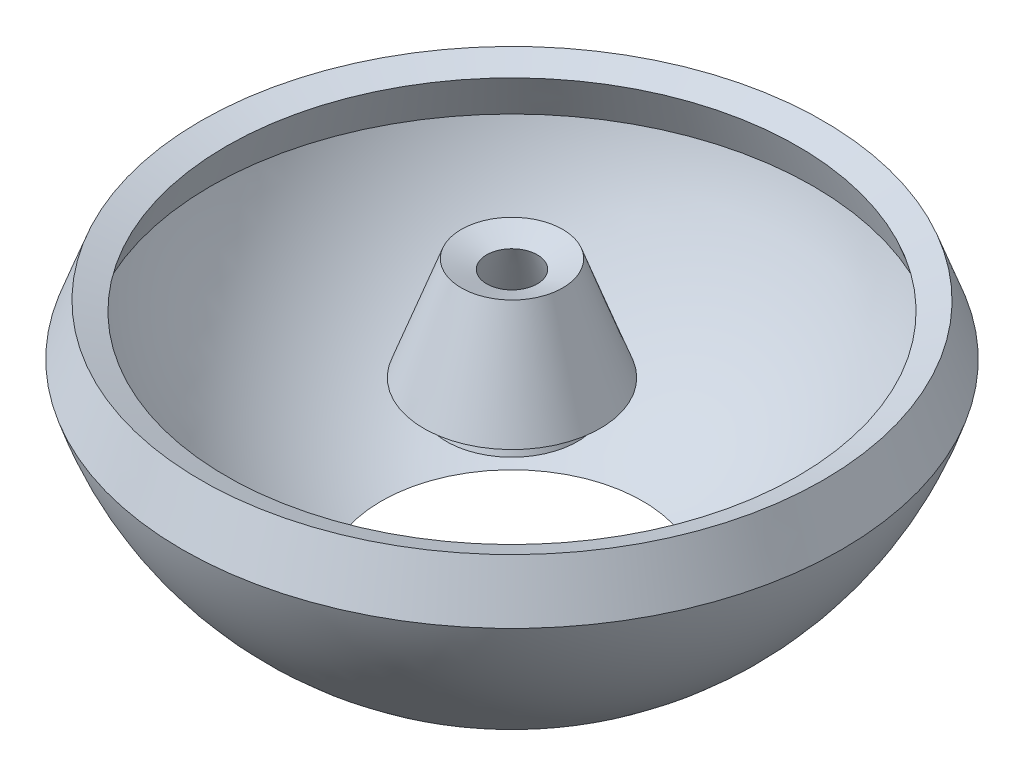
ISO-10303-21;
HEADER;
FILE_DESCRIPTION(('STEP AP214'),'2;1');
FILE_NAME('part.step','',(''),(''),'','','');
FILE_SCHEMA(('AUTOMOTIVE_DESIGN { 1 0 10303 214 1 1 1 1 }'));
ENDSEC;
DATA;
#1=APPLICATION_CONTEXT('core data for automotive mechanical design processes');
#2=APPLICATION_PROTOCOL_DEFINITION('international standard','automotive_design',2000,#1);
#3=PRODUCT_CONTEXT('',#1,'mechanical');
#4=PRODUCT('Part','Part','',(#3));
#5=PRODUCT_RELATED_PRODUCT_CATEGORY('part','',(#4));
#6=PRODUCT_DEFINITION_FORMATION('','',#4);
#7=PRODUCT_DEFINITION_CONTEXT('part definition',#1,'design');
#8=PRODUCT_DEFINITION('design','',#6,#7);
#9=PRODUCT_DEFINITION_SHAPE('','',#8);
#10=(LENGTH_UNIT() NAMED_UNIT(*) SI_UNIT(.MILLI.,.METRE.));
#11=(NAMED_UNIT(*) PLANE_ANGLE_UNIT() SI_UNIT($,.RADIAN.));
#12=(NAMED_UNIT(*) SI_UNIT($,.STERADIAN.) SOLID_ANGLE_UNIT());
#13=UNCERTAINTY_MEASURE_WITH_UNIT(LENGTH_MEASURE(1.E-05),#10,'distance_accuracy_value','');
#14=(GEOMETRIC_REPRESENTATION_CONTEXT(3) GLOBAL_UNCERTAINTY_ASSIGNED_CONTEXT((#13)) GLOBAL_UNIT_ASSIGNED_CONTEXT((#10,
#11,#12)) REPRESENTATION_CONTEXT('',''));
#15=CARTESIAN_POINT('',(0.,0.,0.));
#16=DIRECTION('',(0.,0.,1.));
#17=DIRECTION('',(1.,0.,0.));
#18=AXIS2_PLACEMENT_3D('',#15,#16,#17);
#19=CARTESIAN_POINT('',(0.,-43.4771990234914,0.));
#20=DIRECTION('',(0.,-1.,0.));
#21=DIRECTION('',(1.,0.,0.));
#22=AXIS2_PLACEMENT_3D('',#19,#20,#21);
#23=CONICAL_SURFACE('',#22,32.5852062303105,0.349065850398709);
#24=CARTESIAN_POINT('',(0.,-5.41964788165997,0.));
#25=DIRECTION('',(0.,1.,0.));
#26=DIRECTION('',(-1.,0.,0.));
#27=AXIS2_PLACEMENT_3D('',#24,#25,#26);
#28=CIRCLE('',#27,18.7333904256269);
#29=CARTESIAN_POINT('',(-18.7333904256269,-5.41964788165997,0.));
#30=VERTEX_POINT('',#29);
#31=EDGE_CURVE('E79',#30,#30,#28,.T.);
#32=ORIENTED_EDGE('',*,*,#31,.F.);
#33=EDGE_LOOP('',(#32));
#34=FACE_BOUND('',#33,.T.);
#35=CARTESIAN_POINT('',(0.,-43.4771990234914,0.));
#36=DIRECTION('',(0.,1.,0.));
#37=DIRECTION('',(-1.,0.,0.));
#38=AXIS2_PLACEMENT_3D('',#35,#36,#37);
#39=CIRCLE('',#38,32.5852062303105);
#40=CARTESIAN_POINT('',(-32.5852062303105,-43.4771990234914,0.));
#41=VERTEX_POINT('',#40);
#42=EDGE_CURVE('E11',#41,#41,#39,.T.);
#43=ORIENTED_EDGE('',*,*,#42,.T.);
#44=EDGE_LOOP('',(#43));
#45=FACE_BOUND('',#44,.T.);
#46=ADVANCED_FACE('F51',(#34,#45),#23,.T.);
#47=CARTESIAN_POINT('',(0.,-47.1539155642398,0.));
#48=DIRECTION('',(0.,1.,0.));
#49=DIRECTION('',(-1.,0.,0.));
#50=AXIS2_PLACEMENT_3D('',#47,#48,#49);
#51=CONICAL_SURFACE('',#50,22.4835105568642,1.22173047639619);
#52=ORIENTED_EDGE('',*,*,#42,.F.);
#53=EDGE_LOOP('',(#52));
#54=FACE_BOUND('',#53,.T.);
#55=CARTESIAN_POINT('',(0.,-47.1539155642398,0.));
#56=DIRECTION('',(0.,1.,0.));
#57=DIRECTION('',(-1.,0.,0.));
#58=AXIS2_PLACEMENT_3D('',#55,#56,#57);
#59=CIRCLE('',#58,22.4835105568642);
#60=CARTESIAN_POINT('',(-22.4835105568642,-47.1539155642398,0.));
#61=VERTEX_POINT('',#60);
#62=EDGE_CURVE('E57',#61,#61,#59,.T.);
#63=ORIENTED_EDGE('',*,*,#62,.T.);
#64=EDGE_LOOP('',(#63));
#65=FACE_BOUND('',#64,.T.);
#66=ADVANCED_FACE('F87',(#54,#65),#51,.T.);
#67=CARTESIAN_POINT('',(0.,-51.8523786681699,0.));
#68=DIRECTION('',(0.,-1.,0.));
#69=DIRECTION('',(1.,0.,0.));
#70=AXIS2_PLACEMENT_3D('',#67,#68,#69);
#71=CONICAL_SURFACE('',#70,24.1936112734919,0.349065850398704);
#72=ORIENTED_EDGE('',*,*,#62,.F.);
#73=EDGE_LOOP('',(#72));
#74=FACE_BOUND('',#73,.T.);
#75=CARTESIAN_POINT('',(0.,-51.8523786681699,0.));
#76=DIRECTION('',(0.,1.,0.));
#77=DIRECTION('',(-1.,0.,0.));
#78=AXIS2_PLACEMENT_3D('',#75,#76,#77);
#79=CIRCLE('',#78,24.1936112734919);
#80=CARTESIAN_POINT('',(-24.1936112734919,-51.8523786681699,0.));
#81=VERTEX_POINT('',#80);
#82=EDGE_CURVE('E61',#81,#81,#79,.T.);
#83=ORIENTED_EDGE('',*,*,#82,.T.);
#84=EDGE_LOOP('',(#83));
#85=FACE_BOUND('',#84,.T.);
#86=ADVANCED_FACE('F91',(#74,#85),#71,.T.);
#87=CARTESIAN_POINT('',(0.,-51.8523786681699,0.));
#88=DIRECTION('',(0.,1.,0.));
#89=DIRECTION('',(-1.,0.,0.));
#90=AXIS2_PLACEMENT_3D('',#87,#88,#89);
#91=CONICAL_SURFACE('',#90,24.1936112734919,1.22173047639619);
#92=CARTESIAN_POINT('',(0.,-55.272580101425,0.));
#93=DIRECTION('',(0.,1.,0.));
#94=DIRECTION('',(-1.,0.,0.));
#95=AXIS2_PLACEMENT_3D('',#92,#93,#94);
#96=CIRCLE('',#95,14.7966850656322);
#97=CARTESIAN_POINT('',(-14.7966850656322,-55.272580101425,0.));
#98=VERTEX_POINT('',#97);
#99=EDGE_CURVE('E65',#98,#98,#96,.T.);
#100=ORIENTED_EDGE('',*,*,#99,.T.);
#101=EDGE_LOOP('',(#100));
#102=FACE_BOUND('',#101,.T.);
#103=ORIENTED_EDGE('',*,*,#82,.F.);
#104=EDGE_LOOP('',(#103));
#105=FACE_BOUND('',#104,.T.);
#106=ADVANCED_FACE('F96',(#102,#105),#91,.T.);
#107=CARTESIAN_POINT('',(0.,-55.272580101425,0.));
#108=DIRECTION('',(0.,-1.,0.));
#109=DIRECTION('',(1.,0.,0.));
#110=AXIS2_PLACEMENT_3D('',#107,#108,#109);
#111=CONICAL_SURFACE('',#110,14.7966850656322,0.349065850398705);
#112=CARTESIAN_POINT('',(0.,-41.1771907896353,0.));
#113=DIRECTION('',(0.,1.,0.));
#114=DIRECTION('',(-1.,0.,0.));
#115=AXIS2_PLACEMENT_3D('',#112,#113,#114);
#116=CIRCLE('',#115,9.6663829157494);
#117=CARTESIAN_POINT('',(-9.66638291574939,-41.1771907896353,0.));
#118=VERTEX_POINT('',#117);
#119=EDGE_CURVE('E70',#118,#118,#116,.T.);
#120=ORIENTED_EDGE('',*,*,#119,.T.);
#121=EDGE_LOOP('',(#120));
#122=FACE_BOUND('',#121,.T.);
#123=ORIENTED_EDGE('',*,*,#99,.F.);
#124=EDGE_LOOP('',(#123));
#125=FACE_BOUND('',#124,.T.);
#126=ADVANCED_FACE('F102',(#122,#125),#111,.F.);
#127=CARTESIAN_POINT('',(0.,-41.1771907896353,0.));
#128=DIRECTION('',(0.,1.,0.));
#129=DIRECTION('',(-1.,0.,0.));
#130=AXIS2_PLACEMENT_3D('',#127,#128,#129);
#131=CONICAL_SURFACE('',#130,9.6663829157494,1.22173047639619);
#132=CARTESIAN_POINT('',(0.,-37.500474248887,0.));
#133=DIRECTION('',(0.,1.,0.));
#134=DIRECTION('',(-1.,0.,0.));
#135=AXIS2_PLACEMENT_3D('',#132,#133,#134);
#136=CIRCLE('',#135,19.7680785891957);
#137=CARTESIAN_POINT('',(-19.7680785891957,-37.500474248887,0.));
#138=VERTEX_POINT('',#137);
#139=EDGE_CURVE('E73',#138,#138,#136,.T.);
#140=ORIENTED_EDGE('',*,*,#139,.T.);
#141=EDGE_LOOP('',(#140));
#142=FACE_BOUND('',#141,.T.);
#143=ORIENTED_EDGE('',*,*,#119,.F.);
#144=EDGE_LOOP('',(#143));
#145=FACE_BOUND('',#144,.T.);
#146=ADVANCED_FACE('F106',(#142,#145),#131,.F.);
#147=CARTESIAN_POINT('',(0.,-37.500474248887,0.));
#148=DIRECTION('',(0.,-1.,0.));
#149=DIRECTION('',(1.,0.,0.));
#150=AXIS2_PLACEMENT_3D('',#147,#148,#149);
#151=CONICAL_SURFACE('',#150,19.7680785891957,0.349065850398709);
#152=CARTESIAN_POINT('',(0.,-8.83984931491518,0.));
#153=DIRECTION('',(0.,1.,0.));
#154=DIRECTION('',(-1.,0.,0.));
#155=AXIS2_PLACEMENT_3D('',#152,#153,#154);
#156=CIRCLE('',#155,9.33646421776728);
#157=CARTESIAN_POINT('',(-9.33646421776728,-8.83984931491518,0.));
#158=VERTEX_POINT('',#157);
#159=EDGE_CURVE('E76',#158,#158,#156,.T.);
#160=ORIENTED_EDGE('',*,*,#159,.T.);
#161=EDGE_LOOP('',(#160));
#162=FACE_BOUND('',#161,.T.);
#163=ORIENTED_EDGE('',*,*,#139,.F.);
#164=EDGE_LOOP('',(#163));
#165=FACE_BOUND('',#164,.T.);
#166=ADVANCED_FACE('F110',(#162,#165),#151,.F.);
#167=CARTESIAN_POINT('',(0.,-8.83984931491518,0.));
#168=DIRECTION('',(0.,1.,0.));
#169=DIRECTION('',(-1.,0.,0.));
#170=AXIS2_PLACEMENT_3D('',#167,#168,#169);
#171=CONICAL_SURFACE('',#170,9.33646421776728,1.22173047639619);
#172=ORIENTED_EDGE('',*,*,#31,.T.);
#173=EDGE_LOOP('',(#172));
#174=FACE_BOUND('',#173,.T.);
#175=ORIENTED_EDGE('',*,*,#159,.F.);
#176=EDGE_LOOP('',(#175));
#177=FACE_BOUND('',#176,.T.);
#178=ADVANCED_FACE('F83',(#174,#177),#171,.F.);
#179=CLOSED_SHELL('',(#46,#66,#86,#106,#126,#146,#166,#178));
#180=MANIFOLD_SOLID_BREP('B2',#179);
#181=CARTESIAN_POINT('',(0.,0.,0.));
#182=DIRECTION('',(0.,1.,0.));
#183=DIRECTION('',(1.,0.,0.));
#184=AXIS2_PLACEMENT_3D('',#181,#182,#183);
#185=SPHERICAL_SURFACE('',#184,127.481606516391);
#186=CARTESIAN_POINT('',(0.,-107.105578362388,0.));
#187=DIRECTION('',(0.,1.,0.));
#188=DIRECTION('',(0.,0.,1.));
#189=AXIS2_PLACEMENT_3D('',#186,#187,#188);
#190=CIRCLE('',#189,69.1372192357941);
#191=CARTESIAN_POINT('',(69.1372192357941,-107.105578362388,0.));
#192=VERTEX_POINT('',#191);
#193=EDGE_CURVE('E192',#192,#192,#190,.F.);
#194=CARTESIAN_POINT('',(0.,-37.6070852386461,0.));
#195=DIRECTION('',(0.,1.,0.));
#196=DIRECTION('',(0.,0.,1.));
#197=AXIS2_PLACEMENT_3D('',#194,#195,#196);
#198=CIRCLE('',#197,121.808321307919);
#199=CARTESIAN_POINT('',(121.808321307919,-37.6070852386461,0.));
#200=VERTEX_POINT('',#199);
#201=EDGE_CURVE('E50',#200,#200,#198,.T.);
#202=CARTESIAN_POINT('',(69.1372192357941,-107.105578362388,0.));
#203=CARTESIAN_POINT('',(69.9161139494149,-106.602799748101,0.));
#204=CARTESIAN_POINT('',(70.6895222877938,-106.091521904689,0.));
#205=CARTESIAN_POINT('',(72.2250023689663,-105.052217387132,0.));
#206=CARTESIAN_POINT('',(72.9870741117599,-104.524190712987,0.));
#207=CARTESIAN_POINT('',(74.4995171566603,-103.451638161481,0.));
#208=CARTESIAN_POINT('',(75.249888458767,-102.907112284118,0.));
#209=CARTESIAN_POINT('',(76.7385737917165,-101.801820942386,0.));
#210=CARTESIAN_POINT('',(77.4768878225591,-101.241055478015,0.));
#211=CARTESIAN_POINT('',(78.9411071336241,-100.103551735308,0.));
#212=CARTESIAN_POINT('',(79.6670124138463,-99.5268134569716,0.));
#213=CARTESIAN_POINT('',(81.1060687540076,-98.3576386149248,0.));
#214=CARTESIAN_POINT('',(81.8192198139465,-97.7652020512145,0.));
#215=CARTESIAN_POINT('',(83.2324282863832,-96.5649125974547,0.));
#216=CARTESIAN_POINT('',(83.9324856988808,-95.9570597074051,0.));
#217=CARTESIAN_POINT('',(85.3191736885963,-94.7262269083479,0.));
#218=CARTESIAN_POINT('',(86.0058042658141,-94.1032469993403,0.));
#219=CARTESIAN_POINT('',(87.3653117855811,-92.8424566664397,0.));
#220=CARTESIAN_POINT('',(88.0381887281302,-92.2046462425468,0.));
#221=CARTESIAN_POINT('',(89.3698687256909,-90.9144984432607,0.));
#222=CARTESIAN_POINT('',(90.0286717807026,-90.2621610678676,0.));
#223=CARTESIAN_POINT('',(91.3318904485846,-88.9432698427966,0.));
#224=CARTESIAN_POINT('',(91.976306061455,-88.2767159931188,0.));
#225=CARTESIAN_POINT('',(93.2504431381323,-86.9297090630223,0.));
#226=CARTESIAN_POINT('',(93.8801646019392,-86.2492559826038,0.));
#227=CARTESIAN_POINT('',(95.1246136671763,-84.8747744498357,0.));
#228=CARTESIAN_POINT('',(95.7393412686064,-84.1807459974863,0.));
#229=CARTESIAN_POINT('',(96.9535100320457,-82.7794440408122,0.));
#230=CARTESIAN_POINT('',(97.5529511940549,-82.0721705364876,0.));
#231=CARTESIAN_POINT('',(98.7362617771247,-80.6447150997453,0.));
#232=CARTESIAN_POINT('',(99.3201311981853,-79.9245331673275,0.));
#233=CARTESIAN_POINT('',(100.472020409136,-78.4716036419939,0.));
#234=CARTESIAN_POINT('',(101.040040199026,-77.738856049078,0.));
#235=CARTESIAN_POINT('',(102.159959800978,-76.2611439509168,0.));
#236=CARTESIAN_POINT('',(102.711859613041,-75.5161794456715,0.));
#237=CARTESIAN_POINT('',(103.799276584921,-74.0143880856088,0.));
#238=CARTESIAN_POINT('',(104.334793744737,-73.2575612307914,0.));
#239=CARTESIAN_POINT('',(105.389190534959,-71.7324053801779,0.));
#240=CARTESIAN_POINT('',(105.908070165364,-70.9640763843817,0.));
#241=CARTESIAN_POINT('',(106.928944938161,-69.4162819348,0.));
#242=CARTESIAN_POINT('',(107.430940080554,-68.6368164810146,0.));
#243=CARTESIAN_POINT('',(108.417806954825,-67.0671200987944,0.));
#244=CARTESIAN_POINT('',(108.902678686705,-66.2768891703597,0.));
#245=CARTESIAN_POINT('',(109.855067967269,-64.6860379459653,0.));
#246=CARTESIAN_POINT('',(110.322585515955,-63.8854176500056,0.));
#247=CARTESIAN_POINT('',(111.240043917086,-62.2741687424562,0.));
#248=CARTESIAN_POINT('',(111.689984769532,-61.4635401308665,0.));
#249=CARTESIAN_POINT('',(112.572075630758,-59.8326604073897,0.));
#250=CARTESIAN_POINT('',(113.004225639538,-59.0124092955027,0.));
#251=CARTESIAN_POINT('',(113.850529133242,-57.3626749664721,0.));
#252=CARTESIAN_POINT('',(114.264682618167,-56.5331917493285,0.));
#253=CARTESIAN_POINT('',(115.074795950245,-54.8653879991094,0.));
#254=CARTESIAN_POINT('',(115.470755797399,-54.0270674660338,0.));
#255=CARTESIAN_POINT('',(116.24429339583,-52.3419880782339,0.));
#256=CARTESIAN_POINT('',(116.621871147106,-51.4952292235096,0.));
#257=CARTESIAN_POINT('',(117.358464857169,-49.7936762070777,0.));
#258=CARTESIAN_POINT('',(117.717480815957,-48.9388820453703,0.));
#259=CARTESIAN_POINT('',(118.416780031759,-47.2216652383403,0.));
#260=CARTESIAN_POINT('',(118.757063288775,-46.3592425930179,0.));
#261=CARTESIAN_POINT('',(119.418735283208,-44.6271793313468,0.));
#262=CARTESIAN_POINT('',(119.740124020626,-43.7575387149982,0.));
#263=CARTESIAN_POINT('',(120.36385349506,-42.0114532409927,0.));
#264=CARTESIAN_POINT('',(120.666194232077,-41.1350083833359,0.));
#265=CARTESIAN_POINT('',(121.251685738004,-39.3757322093431,0.));
#266=CARTESIAN_POINT('',(121.534836506914,-38.4929008930072,0.));
#267=CARTESIAN_POINT('',(121.808321307919,-37.6070852386461,0.));
#268=B_SPLINE_CURVE_WITH_KNOTS('',3,(#202,#203,#204,#205,#206,#207,#208,#209,#210,#211,#212,
#213,#214,#215,#216,#217,#218,#219,#220,#221,#222,#223,#224,#225,#226,#227,#228,#229,#230,#231,
#232,#233,#234,#235,#236,#237,#238,#239,#240,#241,#242,#243,#244,#245,#246,#247,#248,#249,#250,
#251,#252,#253,#254,#255,#256,#257,#258,#259,#260,#261,#262,#263,#264,#265,#266,#267),
.UNSPECIFIED.,.F.,.F.,(4,2,2,2,2,2,2,2,2,2,2,2,2,2,2,2,2,2,2,2,2,2,2,2,2,2,2,2,2,2,2,2,4),(0.,
2.78116205541085,5.56232411082171,8.34348616623255,11.1246482216434,13.9058102770542,
16.6869723324651,19.4681343878759,22.2492964432868,25.0304584986976,27.8116205541085,
30.5927826095193,33.3739446649302,36.155106720341,38.9362687757519,41.7174308311627,
44.4985928865736,47.2797549419844,50.0609169973953,52.8420790528061,55.623241108217,
58.4044031636278,61.1855652190387,63.9667272744495,66.7478893298604,69.5290513852712,
72.3102134406821,75.0913754960929,77.8725375515037,80.6536996069146,83.4348616623254,
86.2160237177363,88.9971857731471),.UNSPECIFIED.);
#269=EDGE_CURVE('BSEAM173',#192,#200,#268,.T.);
#270=ORIENTED_EDGE('',*,*,#193,.F.);
#271=ORIENTED_EDGE('',*,*,#201,.F.);
#272=ORIENTED_EDGE('',*,*,#269,.T.);
#273=ORIENTED_EDGE('',*,*,#269,.F.);
#274=EDGE_LOOP('',(#270,#272,#271,#273));
#275=FACE_BOUND('',#274,.T.);
#276=ADVANCED_FACE('F173',(#275),#185,.T.);
#277=CARTESIAN_POINT('',(0.,-41.0272866718983,0.));
#278=DIRECTION('',(0.,-1.,0.));
#279=DIRECTION('',(1.,0.,0.));
#280=AXIS2_PLACEMENT_3D('',#277,#278,#279);
#281=CONICAL_SURFACE('',#280,112.411395100069,0.349065850398713);
#282=CARTESIAN_POINT('',(0.,-22.233434256179,0.));
#283=DIRECTION('',(0.,1.,0.));
#284=DIRECTION('',(-1.,0.,0.));
#285=AXIS2_PLACEMENT_3D('',#282,#283,#284);
#286=CIRCLE('',#285,105.570992233558);
#287=CARTESIAN_POINT('',(-105.570992233558,-22.233434256179,0.));
#288=VERTEX_POINT('',#287);
#289=EDGE_CURVE('E185',#288,#288,#286,.T.);
#290=ORIENTED_EDGE('',*,*,#289,.T.);
#291=EDGE_LOOP('',(#290));
#292=FACE_BOUND('',#291,.T.);
#293=CARTESIAN_POINT('',(0.,-37.7966236055941,0.));
#294=DIRECTION('',(0.,1.,0.));
#295=DIRECTION('',(-1.,0.,0.));
#296=AXIS2_PLACEMENT_3D('',#293,#294,#295);
#297=CIRCLE('',#296,111.235529906992);
#298=CARTESIAN_POINT('',(111.235529906992,-37.796623605594,0.));
#299=VERTEX_POINT('',#298);
#300=EDGE_CURVE('E180',#299,#299,#297,.T.);
#301=ORIENTED_EDGE('',*,*,#300,.F.);
#302=EDGE_LOOP('',(#301));
#303=FACE_BOUND('',#302,.T.);
#304=ADVANCED_FACE('F211',(#292,#303),#281,.F.);
#305=CARTESIAN_POINT('',(0.,-37.6070852386431,0.));
#306=DIRECTION('',(0.,-1.,0.));
#307=DIRECTION('',(1.,0.,0.));
#308=AXIS2_PLACEMENT_3D('',#305,#306,#307);
#309=CONICAL_SURFACE('',#308,121.808321307929,0.349065850398713);
#310=CARTESIAN_POINT('',(0.,-18.8132328229237,0.));
#311=DIRECTION('',(0.,1.,0.));
#312=DIRECTION('',(-1.,0.,0.));
#313=AXIS2_PLACEMENT_3D('',#310,#311,#312);
#314=CIRCLE('',#313,114.967918441418);
#315=CARTESIAN_POINT('',(-114.967918441418,-18.8132328229238,0.));
#316=VERTEX_POINT('',#315);
#317=EDGE_CURVE('E189',#316,#316,#314,.T.);
#318=ORIENTED_EDGE('',*,*,#317,.F.);
#319=EDGE_LOOP('',(#318));
#320=FACE_BOUND('',#319,.T.);
#321=ORIENTED_EDGE('',*,*,#201,.T.);
#322=EDGE_LOOP('',(#321));
#323=FACE_BOUND('',#322,.T.);
#324=ADVANCED_FACE('F217',(#320,#323),#309,.T.);
#325=CARTESIAN_POINT('',(0.,-22.233434256179,0.));
#326=DIRECTION('',(0.,1.,0.));
#327=DIRECTION('',(-1.,0.,0.));
#328=AXIS2_PLACEMENT_3D('',#325,#326,#327);
#329=CONICAL_SURFACE('',#328,105.570992233558,1.22173047639618);
#330=ORIENTED_EDGE('',*,*,#317,.T.);
#331=EDGE_LOOP('',(#330));
#332=FACE_BOUND('',#331,.T.);
#333=ORIENTED_EDGE('',*,*,#289,.F.);
#334=EDGE_LOOP('',(#333));
#335=FACE_BOUND('',#334,.T.);
#336=ADVANCED_FACE('F208',(#332,#335),#329,.F.);
#337=CARTESIAN_POINT('',(0.,0.,0.));
#338=DIRECTION('',(0.,1.,0.));
#339=DIRECTION('',(1.,0.,0.));
#340=AXIS2_PLACEMENT_3D('',#337,#338,#339);
#341=SPHERICAL_SURFACE('',#340,117.481606516391);
#342=CARTESIAN_POINT('',(0.,-107.105578362388,0.));
#343=DIRECTION('',(0.,1.,0.));
#344=DIRECTION('',(0.,0.,1.));
#345=AXIS2_PLACEMENT_3D('',#342,#343,#344);
#346=CIRCLE('',#345,48.2734187035725);
#347=CARTESIAN_POINT('',(48.2734187035724,-107.105578362388,0.));
#348=VERTEX_POINT('',#347);
#349=EDGE_CURVE('E176',#348,#348,#346,.F.);
#350=CARTESIAN_POINT('',(48.2734187035724,-107.105578362388,0.));
#351=CARTESIAN_POINT('',(49.1880611648906,-106.693344345788,0.));
#352=CARTESIAN_POINT('',(50.0974205409018,-106.269388927758,0.));
#353=CARTESIAN_POINT('',(51.9049820934541,-105.39832551048,0.));
#354=CARTESIAN_POINT('',(52.8031842699952,-104.951217511233,0.));
#355=CARTESIAN_POINT('',(54.5878403947516,-104.034139153162,0.));
#356=CARTESIAN_POINT('',(55.4742943429667,-103.564168794339,0.));
#357=CARTESIAN_POINT('',(57.2348726544857,-102.601675014545,0.));
#358=CARTESIAN_POINT('',(58.1089970177895,-102.109151593573,0.));
#359=CARTESIAN_POINT('',(59.8443423689665,-101.101874697328,0.));
#360=CARTESIAN_POINT('',(60.7055633568397,-100.587121222055,0.));
#361=CARTESIAN_POINT('',(62.4145367758642,-99.5357221067404,0.));
#362=CARTESIAN_POINT('',(63.2622892070156,-98.9990764666991,0.));
#363=CARTESIAN_POINT('',(64.9437691328447,-97.9042452006739,0.));
#364=CARTESIAN_POINT('',(65.7774966275223,-97.3460595746899,0.));
#365=CARTESIAN_POINT('',(67.4303795151968,-96.2085146730778,0.));
#366=CARTESIAN_POINT('',(68.2495349081937,-95.6291553974496,0.));
#367=CARTESIAN_POINT('',(69.8727359881198,-94.4496434232869,0.));
#368=CARTESIAN_POINT('',(70.6767816750491,-93.8494907247523,0.));
#369=CARTESIAN_POINT('',(72.2692356555344,-92.628785779545,0.));
#370=CARTESIAN_POINT('',(73.0576439490904,-92.0082335328723,0.));
#371=CARTESIAN_POINT('',(74.618305718,-90.7471367537806,0.));
#372=CARTESIAN_POINT('',(75.3905591933535,-90.1065922213617,0.));
#373=CARTESIAN_POINT('',(76.918404503333,-88.8059312540229,0.));
#374=CARTESIAN_POINT('',(77.673996337959,-88.145814819103,0.));
#375=CARTESIAN_POINT('',(79.1680224788189,-86.80644327483,0.));
#376=CARTESIAN_POINT('',(79.9064567850528,-86.1271881654769,0.));
#377=CARTESIAN_POINT('',(81.3656832417892,-84.7499850609412,0.));
#378=CARTESIAN_POINT('',(82.0864753922916,-84.0520370657586,0.));
#379=CARTESIAN_POINT('',(83.5099444886015,-82.6379062461269,0.));
#380=CARTESIAN_POINT('',(84.2126214344091,-81.9217234216778,0.));
#381=CARTESIAN_POINT('',(85.5993989612011,-80.4715929674198,0.));
#382=CARTESIAN_POINT('',(86.2834995421856,-79.7376453376109,0.));
#383=CARTESIAN_POINT('',(87.6326753706929,-78.2524669554112,0.));
#384=CARTESIAN_POINT('',(88.2977506182157,-77.5012362030203,0.));
#385=CARTESIAN_POINT('',(89.6084392973048,-75.9819846011816,0.));
#386=CARTESIAN_POINT('',(90.2540527288711,-75.2139637517337,0.));
#387=CARTESIAN_POINT('',(91.5253940661548,-73.6616360004855,0.));
#388=CARTESIAN_POINT('',(92.1511219718723,-72.8773290986851,0.));
#389=CARTESIAN_POINT('',(93.3822815982462,-71.292943975816,0.));
#390=CARTESIAN_POINT('',(93.9877133189026,-70.4928657547473,0.));
#391=CARTESIAN_POINT('',(95.1778832361316,-68.8774630769903,0.));
#392=CARTESIAN_POINT('',(95.762621432704,-68.0621386203021,0.));
#393=CARTESIAN_POINT('',(96.911020543711,-66.4167785609159,0.));
#394=CARTESIAN_POINT('',(97.4746814581455,-65.5867429582179,0.));
#395=CARTESIAN_POINT('',(98.5805560796102,-63.9125053511945,0.));
#396=CARTESIAN_POINT('',(99.1227697866404,-63.068303346869,0.));
#397=CARTESIAN_POINT('',(100.185394143739,-61.366286978288,0.));
#398=CARTESIAN_POINT('',(100.705804793807,-60.5084726140323,0.));
#399=CARTESIAN_POINT('',(101.724481496141,-58.779794500794,0.));
#400=CARTESIAN_POINT('',(102.222747548406,-57.9089307518113,0.));
#401=CARTESIAN_POINT('',(103.196808049149,-56.1547254090865,0.));
#402=CARTESIAN_POINT('',(103.672602497626,-55.2713838153444,0.));
#403=CARTESIAN_POINT('',(104.601407526848,-53.4928025099988,0.));
#404=CARTESIAN_POINT('',(105.054418107592,-52.5975627983953,0.));
#405=CARTESIAN_POINT('',(105.937358112097,-50.7957728009033,0.));
#406=CARTESIAN_POINT('',(106.367287535857,-49.8892225150148,0.));
#407=CARTESIAN_POINT('',(107.203783003502,-48.0654063054782,0.));
#408=CARTESIAN_POINT('',(107.610349047388,-47.14814038183,0.));
#409=CARTESIAN_POINT('',(108.399851170016,-45.3034949781007,0.));
#410=CARTESIAN_POINT('',(108.782787248759,-44.3761154980196,0.));
#411=CARTESIAN_POINT('',(109.524777227691,-42.5118512813282,0.));
#412=CARTESIAN_POINT('',(109.88383112788,-41.5749665447179,0.));
#413=CARTESIAN_POINT('',(110.577824450528,-39.6923079162605,0.));
#414=CARTESIAN_POINT('',(110.912763872986,-38.7465340244134,0.));
#415=CARTESIAN_POINT('',(111.235529906992,-37.796623605594,0.));
#416=B_SPLINE_CURVE_WITH_KNOTS('',3,(#350,#351,#352,#353,#354,#355,#356,#357,#358,#359,#360,
#361,#362,#363,#364,#365,#366,#367,#368,#369,#370,#371,#372,#373,#374,#375,#376,#377,#378,#379,
#380,#381,#382,#383,#384,#385,#386,#387,#388,#389,#390,#391,#392,#393,#394,#395,#396,#397,#398,
#399,#400,#401,#402,#403,#404,#405,#406,#407,#408,#409,#410,#411,#412,#413,#414,#415),
.UNSPECIFIED.,.F.,.F.,(4,2,2,2,2,2,2,2,2,2,2,2,2,2,2,2,2,2,2,2,2,2,2,2,2,2,2,2,2,2,2,2,4),(0.,
3.00966321260823,6.01932642521648,9.02898963782471,12.0386528504329,15.0483160630412,
18.0579792756494,21.0676424882577,24.0773057008659,27.0869689134741,30.0966321260824,
33.1062953386906,36.1159585512989,39.1256217639071,42.1352849765153,45.1449481891236,
48.1546114017318,51.16427461434,54.1739378269483,57.1836010395565,60.1932642521648,
63.202927464773,66.2125906773812,69.2222538899895,72.2319171025977,75.2415803152059,
78.2512435278142,81.2609067404224,84.2705699530306,87.2802331656389,90.2898963782471,
93.2995595908554,96.3092228034636),.UNSPECIFIED.);
#417=EDGE_CURVE('BSEAM199',#348,#299,#416,.T.);
#418=ORIENTED_EDGE('',*,*,#349,.T.);
#419=ORIENTED_EDGE('',*,*,#300,.T.);
#420=ORIENTED_EDGE('',*,*,#417,.T.);
#421=ORIENTED_EDGE('',*,*,#417,.F.);
#422=EDGE_LOOP('',(#418,#420,#419,#421));
#423=FACE_BOUND('',#422,.T.);
#424=ADVANCED_FACE('F199',(#423),#341,.F.);
#425=CARTESIAN_POINT('',(-69.1372192357789,-107.105578362388,-121.808321307929));
#426=DIRECTION('',(0.,1.,0.));
#427=DIRECTION('',(0.,0.,1.));
#428=AXIS2_PLACEMENT_3D('',#425,#426,#427);
#429=PLANE('',#428);
#430=ORIENTED_EDGE('',*,*,#193,.T.);
#431=EDGE_LOOP('',(#430));
#432=FACE_BOUND('',#431,.T.);
#433=ORIENTED_EDGE('',*,*,#349,.F.);
#434=EDGE_LOOP('',(#433));
#435=FACE_BOUND('',#434,.T.);
#436=ADVANCED_FACE('F202',(#432,#435),#429,.F.);
#437=CLOSED_SHELL('',(#276,#304,#324,#336,#424,#436));
#438=MANIFOLD_SOLID_BREP('B6',#437);
#439=ADVANCED_BREP_SHAPE_REPRESENTATION('',(#18,#180,#438),#14);
#440=SHAPE_DEFINITION_REPRESENTATION(#9,#439);
ENDSEC;
END-ISO-10303-21;
